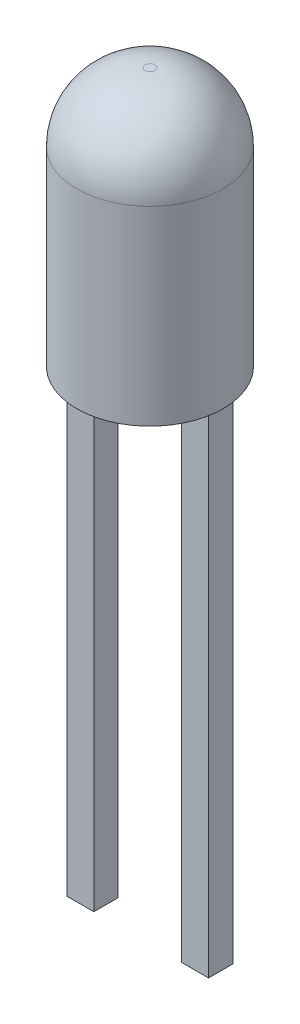
ISO-10303-21;
HEADER;
FILE_DESCRIPTION(('STEP AP214'),'2;1');
FILE_NAME('part.step','',(''),(''),'','','');
FILE_SCHEMA(('AUTOMOTIVE_DESIGN { 1 0 10303 214 1 1 1 1 }'));
ENDSEC;
DATA;
#1=APPLICATION_CONTEXT('core data for automotive mechanical design processes');
#2=APPLICATION_PROTOCOL_DEFINITION('international standard','automotive_design',2000,#1);
#3=PRODUCT_CONTEXT('',#1,'mechanical');
#4=PRODUCT('Part','Part','',(#3));
#5=PRODUCT_RELATED_PRODUCT_CATEGORY('part','',(#4));
#6=PRODUCT_DEFINITION_FORMATION('','',#4);
#7=PRODUCT_DEFINITION_CONTEXT('part definition',#1,'design');
#8=PRODUCT_DEFINITION('design','',#6,#7);
#9=PRODUCT_DEFINITION_SHAPE('','',#8);
#10=(LENGTH_UNIT() NAMED_UNIT(*) SI_UNIT(.MILLI.,.METRE.));
#11=(NAMED_UNIT(*) PLANE_ANGLE_UNIT() SI_UNIT($,.RADIAN.));
#12=(NAMED_UNIT(*) SI_UNIT($,.STERADIAN.) SOLID_ANGLE_UNIT());
#13=UNCERTAINTY_MEASURE_WITH_UNIT(LENGTH_MEASURE(1.E-05),#10,'distance_accuracy_value','');
#14=(GEOMETRIC_REPRESENTATION_CONTEXT(3) GLOBAL_UNCERTAINTY_ASSIGNED_CONTEXT((#13)) GLOBAL_UNIT_ASSIGNED_CONTEXT((#10,
#11,#12)) REPRESENTATION_CONTEXT('',''));
#15=CARTESIAN_POINT('',(0.,0.,0.));
#16=DIRECTION('',(0.,0.,1.));
#17=DIRECTION('',(1.,0.,0.));
#18=AXIS2_PLACEMENT_3D('',#15,#16,#17);
#19=CARTESIAN_POINT('',(0.899999999999999,-10.,0.25));
#20=DIRECTION('',(1.,0.,0.));
#21=DIRECTION('',(0.,0.,-1.));
#22=AXIS2_PLACEMENT_3D('',#19,#20,#21);
#23=PLANE('',#22);
#24=DIRECTION('',(0.,0.,-1.));
#25=VECTOR('',#24,1.);
#26=CARTESIAN_POINT('',(0.899999999999999,0.,0.25));
#27=LINE('',#26,#25);
#28=CARTESIAN_POINT('',(0.899999999999999,0.,0.25));
#29=VERTEX_POINT('',#28);
#30=CARTESIAN_POINT('',(0.899999999999999,0.,-0.25));
#31=VERTEX_POINT('',#30);
#32=EDGE_CURVE('E108',#29,#31,#27,.T.);
#33=ORIENTED_EDGE('',*,*,#32,.T.);
#34=DIRECTION('',(0.,1.,0.));
#35=VECTOR('',#34,1.);
#36=CARTESIAN_POINT('',(0.899999999999999,-10.,-0.25));
#37=LINE('',#36,#35);
#38=CARTESIAN_POINT('',(0.899999999999999,-10.,-0.25));
#39=VERTEX_POINT('',#38);
#40=EDGE_CURVE('E12',#39,#31,#37,.T.);
#41=ORIENTED_EDGE('',*,*,#40,.F.);
#42=DIRECTION('',(0.,0.,-1.));
#43=VECTOR('',#42,1.);
#44=CARTESIAN_POINT('',(0.899999999999999,-10.,0.25));
#45=LINE('',#44,#43);
#46=CARTESIAN_POINT('',(0.899999999999999,-10.,0.25));
#47=VERTEX_POINT('',#46);
#48=EDGE_CURVE('E96',#47,#39,#45,.T.);
#49=ORIENTED_EDGE('',*,*,#48,.F.);
#50=DIRECTION('',(0.,1.,0.));
#51=VECTOR('',#50,1.);
#52=CARTESIAN_POINT('',(0.899999999999999,-10.,0.25));
#53=LINE('',#52,#51);
#54=EDGE_CURVE('E104',#47,#29,#53,.T.);
#55=ORIENTED_EDGE('',*,*,#54,.T.);
#56=EDGE_LOOP('',(#33,#41,#49,#55));
#57=FACE_BOUND('',#56,.T.);
#58=ADVANCED_FACE('F45',(#57),#23,.F.);
#59=CARTESIAN_POINT('',(0.899999999999999,-10.,-0.25));
#60=DIRECTION('',(0.,0.,1.));
#61=DIRECTION('',(1.,0.,0.));
#62=AXIS2_PLACEMENT_3D('',#59,#60,#61);
#63=PLANE('',#62);
#64=DIRECTION('',(1.,0.,0.));
#65=VECTOR('',#64,1.);
#66=CARTESIAN_POINT('',(0.899999999999999,0.,-0.25));
#67=LINE('',#66,#65);
#68=CARTESIAN_POINT('',(1.45,0.,-0.25));
#69=VERTEX_POINT('',#68);
#70=EDGE_CURVE('E100',#31,#69,#67,.T.);
#71=ORIENTED_EDGE('',*,*,#70,.T.);
#72=DIRECTION('',(0.,1.,0.));
#73=VECTOR('',#72,1.);
#74=CARTESIAN_POINT('',(1.45,-10.,-0.25));
#75=LINE('',#74,#73);
#76=CARTESIAN_POINT('',(1.45,-10.,-0.25));
#77=VERTEX_POINT('',#76);
#78=EDGE_CURVE('E53',#77,#69,#75,.T.);
#79=ORIENTED_EDGE('',*,*,#78,.F.);
#80=DIRECTION('',(1.,0.,0.));
#81=VECTOR('',#80,1.);
#82=CARTESIAN_POINT('',(0.899999999999999,-10.,-0.25));
#83=LINE('',#82,#81);
#84=EDGE_CURVE('E91',#39,#77,#83,.T.);
#85=ORIENTED_EDGE('',*,*,#84,.F.);
#86=ORIENTED_EDGE('',*,*,#40,.T.);
#87=EDGE_LOOP('',(#71,#79,#85,#86));
#88=FACE_BOUND('',#87,.T.);
#89=ADVANCED_FACE('F99',(#88),#63,.F.);
#90=CARTESIAN_POINT('',(1.45,-10.,0.25));
#91=DIRECTION('',(-1.,0.,0.));
#92=DIRECTION('',(0.,0.,1.));
#93=AXIS2_PLACEMENT_3D('',#90,#91,#92);
#94=PLANE('',#93);
#95=DIRECTION('',(0.,0.,1.));
#96=VECTOR('',#95,1.);
#97=CARTESIAN_POINT('',(1.45,0.,0.25));
#98=LINE('',#97,#96);
#99=CARTESIAN_POINT('',(1.45,0.,0.25));
#100=VERTEX_POINT('',#99);
#101=EDGE_CURVE('E78',#69,#100,#98,.T.);
#102=ORIENTED_EDGE('',*,*,#101,.T.);
#103=DIRECTION('',(0.,1.,0.));
#104=VECTOR('',#103,1.);
#105=CARTESIAN_POINT('',(1.45,-10.,0.25));
#106=LINE('',#105,#104);
#107=CARTESIAN_POINT('',(1.45,-10.,0.25));
#108=VERTEX_POINT('',#107);
#109=EDGE_CURVE('E101',#108,#100,#106,.T.);
#110=ORIENTED_EDGE('',*,*,#109,.F.);
#111=DIRECTION('',(0.,0.,1.));
#112=VECTOR('',#111,1.);
#113=CARTESIAN_POINT('',(1.45,-10.,0.25));
#114=LINE('',#113,#112);
#115=EDGE_CURVE('E94',#77,#108,#114,.T.);
#116=ORIENTED_EDGE('',*,*,#115,.F.);
#117=ORIENTED_EDGE('',*,*,#78,.T.);
#118=EDGE_LOOP('',(#102,#110,#116,#117));
#119=FACE_BOUND('',#118,.T.);
#120=ADVANCED_FACE('F102',(#119),#94,.F.);
#121=CARTESIAN_POINT('',(0.899999999999999,-10.,0.25));
#122=DIRECTION('',(0.,0.,-1.));
#123=DIRECTION('',(-1.,0.,0.));
#124=AXIS2_PLACEMENT_3D('',#121,#122,#123);
#125=PLANE('',#124);
#126=DIRECTION('',(-1.,0.,0.));
#127=VECTOR('',#126,1.);
#128=CARTESIAN_POINT('',(0.899999999999999,0.,0.25));
#129=LINE('',#128,#127);
#130=EDGE_CURVE('E84',#100,#29,#129,.T.);
#131=ORIENTED_EDGE('',*,*,#130,.T.);
#132=ORIENTED_EDGE('',*,*,#54,.F.);
#133=DIRECTION('',(-1.,0.,0.));
#134=VECTOR('',#133,1.);
#135=CARTESIAN_POINT('',(0.899999999999999,-10.,0.25));
#136=LINE('',#135,#134);
#137=EDGE_CURVE('E61',#108,#47,#136,.T.);
#138=ORIENTED_EDGE('',*,*,#137,.F.);
#139=ORIENTED_EDGE('',*,*,#109,.T.);
#140=EDGE_LOOP('',(#131,#132,#138,#139));
#141=FACE_BOUND('',#140,.T.);
#142=ADVANCED_FACE('F115',(#141),#125,.F.);
#143=CARTESIAN_POINT('',(0.,-10.,0.));
#144=DIRECTION('',(0.,-1.,0.));
#145=DIRECTION('',(0.,0.,-1.));
#146=AXIS2_PLACEMENT_3D('',#143,#144,#145);
#147=PLANE('',#146);
#148=ORIENTED_EDGE('',*,*,#48,.T.);
#149=ORIENTED_EDGE('',*,*,#84,.T.);
#150=ORIENTED_EDGE('',*,*,#115,.T.);
#151=ORIENTED_EDGE('',*,*,#137,.T.);
#152=EDGE_LOOP('',(#148,#149,#150,#151));
#153=FACE_BOUND('',#152,.T.);
#154=ADVANCED_FACE('F92',(#153),#147,.T.);
#155=CARTESIAN_POINT('',(0.,0.,0.));
#156=DIRECTION('',(0.,-1.,0.));
#157=DIRECTION('',(0.,0.,-1.));
#158=AXIS2_PLACEMENT_3D('',#155,#156,#157);
#159=PLANE('',#158);
#160=ORIENTED_EDGE('',*,*,#32,.F.);
#161=ORIENTED_EDGE('',*,*,#130,.F.);
#162=ORIENTED_EDGE('',*,*,#101,.F.);
#163=ORIENTED_EDGE('',*,*,#70,.F.);
#164=EDGE_LOOP('',(#160,#161,#162,#163));
#165=FACE_BOUND('',#164,.T.);
#166=ADVANCED_FACE('F118',(#165),#159,.F.);
#167=CLOSED_SHELL('',(#58,#89,#120,#142,#154,#166));
#168=MANIFOLD_SOLID_BREP('B2',#167);
#169=CARTESIAN_POINT('',(-1.45,-10.,0.25));
#170=DIRECTION('',(1.,0.,0.));
#171=DIRECTION('',(0.,0.,-1.));
#172=AXIS2_PLACEMENT_3D('',#169,#170,#171);
#173=PLANE('',#172);
#174=DIRECTION('',(0.,0.,-1.));
#175=VECTOR('',#174,1.);
#176=CARTESIAN_POINT('',(-1.45,0.,0.25));
#177=LINE('',#176,#175);
#178=CARTESIAN_POINT('',(-1.45,0.,0.25));
#179=VERTEX_POINT('',#178);
#180=CARTESIAN_POINT('',(-1.45,0.,-0.25));
#181=VERTEX_POINT('',#180);
#182=EDGE_CURVE('E241',#179,#181,#177,.T.);
#183=ORIENTED_EDGE('',*,*,#182,.T.);
#184=DIRECTION('',(0.,1.,0.));
#185=VECTOR('',#184,1.);
#186=CARTESIAN_POINT('',(-1.45,-10.,-0.25));
#187=LINE('',#186,#185);
#188=CARTESIAN_POINT('',(-1.45,-10.,-0.25));
#189=VERTEX_POINT('',#188);
#190=EDGE_CURVE('E43',#189,#181,#187,.T.);
#191=ORIENTED_EDGE('',*,*,#190,.F.);
#192=DIRECTION('',(0.,0.,-1.));
#193=VECTOR('',#192,1.);
#194=CARTESIAN_POINT('',(-1.45,-10.,0.25));
#195=LINE('',#194,#193);
#196=CARTESIAN_POINT('',(-1.45,-10.,0.25));
#197=VERTEX_POINT('',#196);
#198=EDGE_CURVE('E229',#197,#189,#195,.T.);
#199=ORIENTED_EDGE('',*,*,#198,.F.);
#200=DIRECTION('',(0.,1.,0.));
#201=VECTOR('',#200,1.);
#202=CARTESIAN_POINT('',(-1.45,-10.,0.25));
#203=LINE('',#202,#201);
#204=EDGE_CURVE('E237',#197,#179,#203,.T.);
#205=ORIENTED_EDGE('',*,*,#204,.T.);
#206=EDGE_LOOP('',(#183,#191,#199,#205));
#207=FACE_BOUND('',#206,.T.);
#208=ADVANCED_FACE('F178',(#207),#173,.F.);
#209=CARTESIAN_POINT('',(-1.45,-10.,-0.25));
#210=DIRECTION('',(0.,0.,1.));
#211=DIRECTION('',(1.,0.,0.));
#212=AXIS2_PLACEMENT_3D('',#209,#210,#211);
#213=PLANE('',#212);
#214=DIRECTION('',(1.,0.,0.));
#215=VECTOR('',#214,1.);
#216=CARTESIAN_POINT('',(-1.45,0.,-0.25));
#217=LINE('',#216,#215);
#218=CARTESIAN_POINT('',(-0.9,0.,-0.25));
#219=VERTEX_POINT('',#218);
#220=EDGE_CURVE('E233',#181,#219,#217,.T.);
#221=ORIENTED_EDGE('',*,*,#220,.T.);
#222=DIRECTION('',(0.,1.,0.));
#223=VECTOR('',#222,1.);
#224=CARTESIAN_POINT('',(-0.9,-10.,-0.25));
#225=LINE('',#224,#223);
#226=CARTESIAN_POINT('',(-0.9,-10.,-0.25));
#227=VERTEX_POINT('',#226);
#228=EDGE_CURVE('E186',#227,#219,#225,.T.);
#229=ORIENTED_EDGE('',*,*,#228,.F.);
#230=DIRECTION('',(1.,0.,0.));
#231=VECTOR('',#230,1.);
#232=CARTESIAN_POINT('',(-1.45,-10.,-0.25));
#233=LINE('',#232,#231);
#234=EDGE_CURVE('E224',#189,#227,#233,.T.);
#235=ORIENTED_EDGE('',*,*,#234,.F.);
#236=ORIENTED_EDGE('',*,*,#190,.T.);
#237=EDGE_LOOP('',(#221,#229,#235,#236));
#238=FACE_BOUND('',#237,.T.);
#239=ADVANCED_FACE('F232',(#238),#213,.F.);
#240=CARTESIAN_POINT('',(-0.9,-10.,0.25));
#241=DIRECTION('',(-1.,0.,0.));
#242=DIRECTION('',(0.,0.,1.));
#243=AXIS2_PLACEMENT_3D('',#240,#241,#242);
#244=PLANE('',#243);
#245=DIRECTION('',(0.,0.,1.));
#246=VECTOR('',#245,1.);
#247=CARTESIAN_POINT('',(-0.9,0.,0.25));
#248=LINE('',#247,#246);
#249=CARTESIAN_POINT('',(-0.9,0.,0.25));
#250=VERTEX_POINT('',#249);
#251=EDGE_CURVE('E211',#219,#250,#248,.T.);
#252=ORIENTED_EDGE('',*,*,#251,.T.);
#253=DIRECTION('',(0.,1.,0.));
#254=VECTOR('',#253,1.);
#255=CARTESIAN_POINT('',(-0.9,-10.,0.25));
#256=LINE('',#255,#254);
#257=CARTESIAN_POINT('',(-0.9,-10.,0.25));
#258=VERTEX_POINT('',#257);
#259=EDGE_CURVE('E234',#258,#250,#256,.T.);
#260=ORIENTED_EDGE('',*,*,#259,.F.);
#261=DIRECTION('',(0.,0.,1.));
#262=VECTOR('',#261,1.);
#263=CARTESIAN_POINT('',(-0.9,-10.,0.25));
#264=LINE('',#263,#262);
#265=EDGE_CURVE('E227',#227,#258,#264,.T.);
#266=ORIENTED_EDGE('',*,*,#265,.F.);
#267=ORIENTED_EDGE('',*,*,#228,.T.);
#268=EDGE_LOOP('',(#252,#260,#266,#267));
#269=FACE_BOUND('',#268,.T.);
#270=ADVANCED_FACE('F235',(#269),#244,.F.);
#271=CARTESIAN_POINT('',(-1.45,-10.,0.25));
#272=DIRECTION('',(0.,0.,-1.));
#273=DIRECTION('',(-1.,0.,0.));
#274=AXIS2_PLACEMENT_3D('',#271,#272,#273);
#275=PLANE('',#274);
#276=DIRECTION('',(-1.,0.,0.));
#277=VECTOR('',#276,1.);
#278=CARTESIAN_POINT('',(-1.45,0.,0.25));
#279=LINE('',#278,#277);
#280=EDGE_CURVE('E217',#250,#179,#279,.T.);
#281=ORIENTED_EDGE('',*,*,#280,.T.);
#282=ORIENTED_EDGE('',*,*,#204,.F.);
#283=DIRECTION('',(-1.,0.,0.));
#284=VECTOR('',#283,1.);
#285=CARTESIAN_POINT('',(-1.45,-10.,0.25));
#286=LINE('',#285,#284);
#287=EDGE_CURVE('E194',#258,#197,#286,.T.);
#288=ORIENTED_EDGE('',*,*,#287,.F.);
#289=ORIENTED_EDGE('',*,*,#259,.T.);
#290=EDGE_LOOP('',(#281,#282,#288,#289));
#291=FACE_BOUND('',#290,.T.);
#292=ADVANCED_FACE('F248',(#291),#275,.F.);
#293=CARTESIAN_POINT('',(0.,-10.,0.));
#294=DIRECTION('',(0.,-1.,0.));
#295=DIRECTION('',(0.,0.,-1.));
#296=AXIS2_PLACEMENT_3D('',#293,#294,#295);
#297=PLANE('',#296);
#298=ORIENTED_EDGE('',*,*,#198,.T.);
#299=ORIENTED_EDGE('',*,*,#234,.T.);
#300=ORIENTED_EDGE('',*,*,#265,.T.);
#301=ORIENTED_EDGE('',*,*,#287,.T.);
#302=EDGE_LOOP('',(#298,#299,#300,#301));
#303=FACE_BOUND('',#302,.T.);
#304=ADVANCED_FACE('F225',(#303),#297,.T.);
#305=CARTESIAN_POINT('',(0.,0.,0.));
#306=DIRECTION('',(0.,-1.,0.));
#307=DIRECTION('',(0.,0.,-1.));
#308=AXIS2_PLACEMENT_3D('',#305,#306,#307);
#309=PLANE('',#308);
#310=ORIENTED_EDGE('',*,*,#182,.F.);
#311=ORIENTED_EDGE('',*,*,#280,.F.);
#312=ORIENTED_EDGE('',*,*,#251,.F.);
#313=ORIENTED_EDGE('',*,*,#220,.F.);
#314=EDGE_LOOP('',(#310,#311,#312,#313));
#315=FACE_BOUND('',#314,.T.);
#316=ADVANCED_FACE('F251',(#315),#309,.F.);
#317=CLOSED_SHELL('',(#208,#239,#270,#292,#304,#316));
#318=MANIFOLD_SOLID_BREP('B6',#317);
#319=CARTESIAN_POINT('',(1.45,0.,-0.25));
#320=DIRECTION('',(1.,0.,0.));
#321=DIRECTION('',(0.,1.,0.));
#322=AXIS2_PLACEMENT_3D('',#319,#320,#321);
#323=PLANE('',#322);
#324=DIRECTION('',(0.,0.,1.));
#325=VECTOR('',#324,1.);
#326=CARTESIAN_POINT('',(1.45,2.6,-0.25));
#327=LINE('',#326,#325);
#328=CARTESIAN_POINT('',(1.45,2.6,-0.25));
#329=VERTEX_POINT('',#328);
#330=CARTESIAN_POINT('',(1.45,2.6,0.25));
#331=VERTEX_POINT('',#330);
#332=EDGE_CURVE('E314',#329,#331,#327,.T.);
#333=ORIENTED_EDGE('',*,*,#332,.T.);
#334=DIRECTION('',(0.,1.,0.));
#335=VECTOR('',#334,1.);
#336=CARTESIAN_POINT('',(1.45,0.,0.25));
#337=LINE('',#336,#335);
#338=CARTESIAN_POINT('',(1.45,0.,0.25));
#339=VERTEX_POINT('',#338);
#340=EDGE_CURVE('E363',#339,#331,#337,.T.);
#341=ORIENTED_EDGE('',*,*,#340,.F.);
#342=DIRECTION('',(0.,0.,1.));
#343=VECTOR('',#342,1.);
#344=CARTESIAN_POINT('',(1.45,0.,-0.25));
#345=LINE('',#344,#343);
#346=CARTESIAN_POINT('',(1.45,0.,-0.25));
#347=VERTEX_POINT('',#346);
#348=EDGE_CURVE('E176',#347,#339,#345,.T.);
#349=ORIENTED_EDGE('',*,*,#348,.F.);
#350=DIRECTION('',(0.,1.,0.));
#351=VECTOR('',#350,1.);
#352=CARTESIAN_POINT('',(1.45,0.,-0.25));
#353=LINE('',#352,#351);
#354=EDGE_CURVE('E364',#347,#329,#353,.T.);
#355=ORIENTED_EDGE('',*,*,#354,.T.);
#356=EDGE_LOOP('',(#333,#341,#349,#355));
#357=FACE_BOUND('',#356,.T.);
#358=ADVANCED_FACE('F311',(#357),#323,.T.);
#359=CARTESIAN_POINT('',(0.899999999999999,0.,-0.25));
#360=DIRECTION('',(0.,-1.,0.));
#361=DIRECTION('',(1.,0.,0.));
#362=AXIS2_PLACEMENT_3D('',#359,#360,#361);
#363=PLANE('',#362);
#364=ORIENTED_EDGE('',*,*,#348,.T.);
#365=DIRECTION('',(1.,0.,0.));
#366=VECTOR('',#365,1.);
#367=CARTESIAN_POINT('',(0.899999999999999,0.,0.25));
#368=LINE('',#367,#366);
#369=CARTESIAN_POINT('',(0.899999999999999,0.,0.25));
#370=VERTEX_POINT('',#369);
#371=EDGE_CURVE('E381',#370,#339,#368,.T.);
#372=ORIENTED_EDGE('',*,*,#371,.F.);
#373=DIRECTION('',(0.,0.,1.));
#374=VECTOR('',#373,1.);
#375=CARTESIAN_POINT('',(0.899999999999999,0.,-0.25));
#376=LINE('',#375,#374);
#377=CARTESIAN_POINT('',(0.899999999999999,0.,-0.25));
#378=VERTEX_POINT('',#377);
#379=EDGE_CURVE('E319',#378,#370,#376,.T.);
#380=ORIENTED_EDGE('',*,*,#379,.F.);
#381=DIRECTION('',(1.,0.,0.));
#382=VECTOR('',#381,1.);
#383=CARTESIAN_POINT('',(0.899999999999999,0.,-0.25));
#384=LINE('',#383,#382);
#385=EDGE_CURVE('E369',#378,#347,#384,.T.);
#386=ORIENTED_EDGE('',*,*,#385,.T.);
#387=EDGE_LOOP('',(#364,#372,#380,#386));
#388=FACE_BOUND('',#387,.T.);
#389=ADVANCED_FACE('F421',(#388),#363,.T.);
#390=CARTESIAN_POINT('',(0.899999999999999,0.6,-0.25));
#391=DIRECTION('',(-1.,0.,0.));
#392=DIRECTION('',(0.,0.,1.));
#393=AXIS2_PLACEMENT_3D('',#390,#391,#392);
#394=PLANE('',#393);
#395=ORIENTED_EDGE('',*,*,#379,.T.);
#396=DIRECTION('',(0.,-1.,0.));
#397=VECTOR('',#396,1.);
#398=CARTESIAN_POINT('',(0.899999999999999,0.6,0.25));
#399=LINE('',#398,#397);
#400=CARTESIAN_POINT('',(0.899999999999999,0.6,0.25));
#401=VERTEX_POINT('',#400);
#402=EDGE_CURVE('E388',#401,#370,#399,.T.);
#403=ORIENTED_EDGE('',*,*,#402,.F.);
#404=DIRECTION('',(0.,0.,1.));
#405=VECTOR('',#404,1.);
#406=CARTESIAN_POINT('',(0.899999999999999,0.6,-0.25));
#407=LINE('',#406,#405);
#408=CARTESIAN_POINT('',(0.899999999999999,0.6,-0.25));
#409=VERTEX_POINT('',#408);
#410=EDGE_CURVE('E404',#409,#401,#407,.T.);
#411=ORIENTED_EDGE('',*,*,#410,.F.);
#412=DIRECTION('',(0.,-1.,0.));
#413=VECTOR('',#412,1.);
#414=CARTESIAN_POINT('',(0.899999999999999,0.6,-0.25));
#415=LINE('',#414,#413);
#416=EDGE_CURVE('E400',#409,#378,#415,.T.);
#417=ORIENTED_EDGE('',*,*,#416,.T.);
#418=EDGE_LOOP('',(#395,#403,#411,#417));
#419=FACE_BOUND('',#418,.T.);
#420=ADVANCED_FACE('F417',(#419),#394,.T.);
#421=CARTESIAN_POINT('',(0.496677265615149,0.6,-0.25));
#422=DIRECTION('',(0.,-1.,0.));
#423=DIRECTION('',(0.,0.,-1.));
#424=AXIS2_PLACEMENT_3D('',#421,#422,#423);
#425=PLANE('',#424);
#426=ORIENTED_EDGE('',*,*,#410,.T.);
#427=DIRECTION('',(1.,0.,0.));
#428=VECTOR('',#427,1.);
#429=CARTESIAN_POINT('',(0.496677265615149,0.6,0.25));
#430=LINE('',#429,#428);
#431=CARTESIAN_POINT('',(0.496677265615149,0.6,0.25));
#432=VERTEX_POINT('',#431);
#433=EDGE_CURVE('E385',#432,#401,#430,.T.);
#434=ORIENTED_EDGE('',*,*,#433,.F.);
#435=DIRECTION('',(0.,0.,1.));
#436=VECTOR('',#435,1.);
#437=CARTESIAN_POINT('',(0.496677265615149,0.6,-0.25));
#438=LINE('',#437,#436);
#439=CARTESIAN_POINT('',(0.496677265615149,0.6,-0.25));
#440=VERTEX_POINT('',#439);
#441=EDGE_CURVE('E406',#440,#432,#438,.T.);
#442=ORIENTED_EDGE('',*,*,#441,.F.);
#443=DIRECTION('',(1.,0.,0.));
#444=VECTOR('',#443,1.);
#445=CARTESIAN_POINT('',(0.496677265615149,0.6,-0.25));
#446=LINE('',#445,#444);
#447=EDGE_CURVE('E397',#440,#409,#446,.T.);
#448=ORIENTED_EDGE('',*,*,#447,.T.);
#449=EDGE_LOOP('',(#426,#434,#442,#448));
#450=FACE_BOUND('',#449,.T.);
#451=ADVANCED_FACE('F414',(#450),#425,.T.);
#452=CARTESIAN_POINT('',(-0.872452828416084,2.6,-0.25));
#453=DIRECTION('',(-0.825170902439274,-0.56488315762426,0.));
#454=DIRECTION('',(0.56488315762426,-0.825170902439274,0.));
#455=AXIS2_PLACEMENT_3D('',#452,#453,#454);
#456=PLANE('',#455);
#457=ORIENTED_EDGE('',*,*,#441,.T.);
#458=DIRECTION('',(0.56488315762426,-0.825170902439274,0.));
#459=VECTOR('',#458,1.);
#460=CARTESIAN_POINT('',(-0.872452828416084,2.6,0.25));
#461=LINE('',#460,#459);
#462=CARTESIAN_POINT('',(-0.872452828416084,2.6,0.25));
#463=VERTEX_POINT('',#462);
#464=EDGE_CURVE('E376',#463,#432,#461,.T.);
#465=ORIENTED_EDGE('',*,*,#464,.F.);
#466=DIRECTION('',(0.,0.,1.));
#467=VECTOR('',#466,1.);
#468=CARTESIAN_POINT('',(-0.872452828416084,2.6,-0.25));
#469=LINE('',#468,#467);
#470=CARTESIAN_POINT('',(-0.872452828416084,2.6,-0.25));
#471=VERTEX_POINT('',#470);
#472=EDGE_CURVE('E368',#471,#463,#469,.T.);
#473=ORIENTED_EDGE('',*,*,#472,.F.);
#474=DIRECTION('',(0.56488315762426,-0.825170902439274,0.));
#475=VECTOR('',#474,1.);
#476=CARTESIAN_POINT('',(-0.872452828416084,2.6,-0.25));
#477=LINE('',#476,#475);
#478=EDGE_CURVE('E394',#471,#440,#477,.T.);
#479=ORIENTED_EDGE('',*,*,#478,.T.);
#480=EDGE_LOOP('',(#457,#465,#473,#479));
#481=FACE_BOUND('',#480,.T.);
#482=ADVANCED_FACE('F408',(#481),#456,.T.);
#483=CARTESIAN_POINT('',(1.45,2.6,-0.25));
#484=DIRECTION('',(0.,1.,0.));
#485=DIRECTION('',(-1.,0.,0.));
#486=AXIS2_PLACEMENT_3D('',#483,#484,#485);
#487=PLANE('',#486);
#488=ORIENTED_EDGE('',*,*,#472,.T.);
#489=DIRECTION('',(-1.,0.,0.));
#490=VECTOR('',#489,1.);
#491=CARTESIAN_POINT('',(1.45,2.6,0.25));
#492=LINE('',#491,#490);
#493=EDGE_CURVE('E371',#331,#463,#492,.T.);
#494=ORIENTED_EDGE('',*,*,#493,.F.);
#495=ORIENTED_EDGE('',*,*,#332,.F.);
#496=DIRECTION('',(-1.,0.,0.));
#497=VECTOR('',#496,1.);
#498=CARTESIAN_POINT('',(1.45,2.6,-0.25));
#499=LINE('',#498,#497);
#500=EDGE_CURVE('E392',#329,#471,#499,.T.);
#501=ORIENTED_EDGE('',*,*,#500,.T.);
#502=EDGE_LOOP('',(#488,#494,#495,#501));
#503=FACE_BOUND('',#502,.T.);
#504=ADVANCED_FACE('F372',(#503),#487,.T.);
#505=CARTESIAN_POINT('',(0.,0.,-0.25));
#506=DIRECTION('',(0.,0.,1.));
#507=DIRECTION('',(1.,0.,0.));
#508=AXIS2_PLACEMENT_3D('',#505,#506,#507);
#509=PLANE('',#508);
#510=ORIENTED_EDGE('',*,*,#354,.F.);
#511=ORIENTED_EDGE('',*,*,#385,.F.);
#512=ORIENTED_EDGE('',*,*,#416,.F.);
#513=ORIENTED_EDGE('',*,*,#447,.F.);
#514=ORIENTED_EDGE('',*,*,#478,.F.);
#515=ORIENTED_EDGE('',*,*,#500,.F.);
#516=EDGE_LOOP('',(#510,#511,#512,#513,#514,#515));
#517=FACE_BOUND('',#516,.T.);
#518=ADVANCED_FACE('F420',(#517),#509,.F.);
#519=CARTESIAN_POINT('',(0.,0.,0.25));
#520=DIRECTION('',(0.,0.,1.));
#521=DIRECTION('',(1.,0.,0.));
#522=AXIS2_PLACEMENT_3D('',#519,#520,#521);
#523=PLANE('',#522);
#524=ORIENTED_EDGE('',*,*,#340,.T.);
#525=ORIENTED_EDGE('',*,*,#493,.T.);
#526=ORIENTED_EDGE('',*,*,#464,.T.);
#527=ORIENTED_EDGE('',*,*,#433,.T.);
#528=ORIENTED_EDGE('',*,*,#402,.T.);
#529=ORIENTED_EDGE('',*,*,#371,.T.);
#530=EDGE_LOOP('',(#524,#525,#526,#527,#528,#529));
#531=FACE_BOUND('',#530,.T.);
#532=ADVANCED_FACE('F379',(#531),#523,.T.);
#533=CLOSED_SHELL('',(#358,#389,#420,#451,#482,#504,#518,#532));
#534=MANIFOLD_SOLID_BREP('B37',#533);
#535=CARTESIAN_POINT('',(-0.9,0.,-0.25));
#536=DIRECTION('',(1.,0.,0.));
#537=DIRECTION('',(0.,0.,-1.));
#538=AXIS2_PLACEMENT_3D('',#535,#536,#537);
#539=PLANE('',#538);
#540=DIRECTION('',(0.,0.,1.));
#541=VECTOR('',#540,1.);
#542=CARTESIAN_POINT('',(-0.9,0.6,-0.25));
#543=LINE('',#542,#541);
#544=CARTESIAN_POINT('',(-0.9,0.6,-0.25));
#545=VERTEX_POINT('',#544);
#546=CARTESIAN_POINT('',(-0.9,0.6,0.25));
#547=VERTEX_POINT('',#546);
#548=EDGE_CURVE('E496',#545,#547,#543,.T.);
#549=ORIENTED_EDGE('',*,*,#548,.T.);
#550=DIRECTION('',(0.,1.,0.));
#551=VECTOR('',#550,1.);
#552=CARTESIAN_POINT('',(-0.9,0.,0.25));
#553=LINE('',#552,#551);
#554=CARTESIAN_POINT('',(-0.9,0.,0.25));
#555=VERTEX_POINT('',#554);
#556=EDGE_CURVE('E551',#555,#547,#553,.T.);
#557=ORIENTED_EDGE('',*,*,#556,.F.);
#558=DIRECTION('',(0.,0.,1.));
#559=VECTOR('',#558,1.);
#560=CARTESIAN_POINT('',(-0.9,0.,-0.25));
#561=LINE('',#560,#559);
#562=CARTESIAN_POINT('',(-0.9,0.,-0.25));
#563=VERTEX_POINT('',#562);
#564=EDGE_CURVE('E309',#563,#555,#561,.T.);
#565=ORIENTED_EDGE('',*,*,#564,.F.);
#566=DIRECTION('',(0.,1.,0.));
#567=VECTOR('',#566,1.);
#568=CARTESIAN_POINT('',(-0.9,0.,-0.25));
#569=LINE('',#568,#567);
#570=EDGE_CURVE('E552',#563,#545,#569,.T.);
#571=ORIENTED_EDGE('',*,*,#570,.T.);
#572=EDGE_LOOP('',(#549,#557,#565,#571));
#573=FACE_BOUND('',#572,.T.);
#574=ADVANCED_FACE('F493',(#573),#539,.T.);
#575=CARTESIAN_POINT('',(-1.45,0.,-0.25));
#576=DIRECTION('',(0.,-1.,0.));
#577=DIRECTION('',(1.,0.,0.));
#578=AXIS2_PLACEMENT_3D('',#575,#576,#577);
#579=PLANE('',#578);
#580=ORIENTED_EDGE('',*,*,#564,.T.);
#581=DIRECTION('',(1.,0.,0.));
#582=VECTOR('',#581,1.);
#583=CARTESIAN_POINT('',(-1.45,0.,0.25));
#584=LINE('',#583,#582);
#585=CARTESIAN_POINT('',(-1.45,0.,0.25));
#586=VERTEX_POINT('',#585);
#587=EDGE_CURVE('E569',#586,#555,#584,.T.);
#588=ORIENTED_EDGE('',*,*,#587,.F.);
#589=DIRECTION('',(0.,0.,1.));
#590=VECTOR('',#589,1.);
#591=CARTESIAN_POINT('',(-1.45,0.,-0.25));
#592=LINE('',#591,#590);
#593=CARTESIAN_POINT('',(-1.45,0.,-0.25));
#594=VERTEX_POINT('',#593);
#595=EDGE_CURVE('E501',#594,#586,#592,.T.);
#596=ORIENTED_EDGE('',*,*,#595,.F.);
#597=DIRECTION('',(1.,0.,0.));
#598=VECTOR('',#597,1.);
#599=CARTESIAN_POINT('',(-1.45,0.,-0.25));
#600=LINE('',#599,#598);
#601=EDGE_CURVE('E557',#594,#563,#600,.T.);
#602=ORIENTED_EDGE('',*,*,#601,.T.);
#603=EDGE_LOOP('',(#580,#588,#596,#602));
#604=FACE_BOUND('',#603,.T.);
#605=ADVANCED_FACE('F621',(#604),#579,.T.);
#606=CARTESIAN_POINT('',(-1.45,2.6,-0.25));
#607=DIRECTION('',(-1.,0.,0.));
#608=DIRECTION('',(0.,0.,1.));
#609=AXIS2_PLACEMENT_3D('',#606,#607,#608);
#610=PLANE('',#609);
#611=ORIENTED_EDGE('',*,*,#595,.T.);
#612=DIRECTION('',(0.,-1.,0.));
#613=VECTOR('',#612,1.);
#614=CARTESIAN_POINT('',(-1.45,2.6,0.25));
#615=LINE('',#614,#613);
#616=CARTESIAN_POINT('',(-1.45,2.6,0.25));
#617=VERTEX_POINT('',#616);
#618=EDGE_CURVE('E579',#617,#586,#615,.T.);
#619=ORIENTED_EDGE('',*,*,#618,.F.);
#620=DIRECTION('',(0.,0.,1.));
#621=VECTOR('',#620,1.);
#622=CARTESIAN_POINT('',(-1.45,2.6,-0.25));
#623=LINE('',#622,#621);
#624=CARTESIAN_POINT('',(-1.45,2.6,-0.25));
#625=VERTEX_POINT('',#624);
#626=EDGE_CURVE('E598',#625,#617,#623,.T.);
#627=ORIENTED_EDGE('',*,*,#626,.F.);
#628=DIRECTION('',(0.,-1.,0.));
#629=VECTOR('',#628,1.);
#630=CARTESIAN_POINT('',(-1.45,2.6,-0.25));
#631=LINE('',#630,#629);
#632=EDGE_CURVE('E594',#625,#594,#631,.T.);
#633=ORIENTED_EDGE('',*,*,#632,.T.);
#634=EDGE_LOOP('',(#611,#619,#627,#633));
#635=FACE_BOUND('',#634,.T.);
#636=ADVANCED_FACE('F619',(#635),#610,.T.);
#637=CARTESIAN_POINT('',(-1.22535509609001,2.6,-0.25));
#638=DIRECTION('',(0.,1.,0.));
#639=DIRECTION('',(0.,0.,1.));
#640=AXIS2_PLACEMENT_3D('',#637,#638,#639);
#641=PLANE('',#640);
#642=ORIENTED_EDGE('',*,*,#626,.T.);
#643=DIRECTION('',(-1.,0.,0.));
#644=VECTOR('',#643,1.);
#645=CARTESIAN_POINT('',(-1.22535509609001,2.6,0.25));
#646=LINE('',#645,#644);
#647=CARTESIAN_POINT('',(-1.22535509609001,2.6,0.25));
#648=VERTEX_POINT('',#647);
#649=EDGE_CURVE('E576',#648,#617,#646,.T.);
#650=ORIENTED_EDGE('',*,*,#649,.F.);
#651=DIRECTION('',(0.,0.,1.));
#652=VECTOR('',#651,1.);
#653=CARTESIAN_POINT('',(-1.22535509609001,2.6,-0.25));
#654=LINE('',#653,#652);
#655=CARTESIAN_POINT('',(-1.22535509609001,2.6,-0.25));
#656=VERTEX_POINT('',#655);
#657=EDGE_CURVE('E600',#656,#648,#654,.T.);
#658=ORIENTED_EDGE('',*,*,#657,.F.);
#659=DIRECTION('',(-1.,0.,0.));
#660=VECTOR('',#659,1.);
#661=CARTESIAN_POINT('',(-1.22535509609001,2.6,-0.25));
#662=LINE('',#661,#660);
#663=EDGE_CURVE('E591',#656,#625,#662,.T.);
#664=ORIENTED_EDGE('',*,*,#663,.T.);
#665=EDGE_LOOP('',(#642,#650,#658,#664));
#666=FACE_BOUND('',#665,.T.);
#667=ADVANCED_FACE('F613',(#666),#641,.T.);
#668=CARTESIAN_POINT('',(-0.62411419560851,0.825037810223286,-0.25));
#669=DIRECTION('',(0.947137436510032,0.320828110303952,0.));
#670=DIRECTION('',(-0.320828110303952,0.947137436510032,0.));
#671=AXIS2_PLACEMENT_3D('',#668,#669,#670);
#672=PLANE('',#671);
#673=ORIENTED_EDGE('',*,*,#657,.T.);
#674=DIRECTION('',(-0.320828110303952,0.947137436510032,0.));
#675=VECTOR('',#674,1.);
#676=CARTESIAN_POINT('',(-0.62411419560851,0.825037810223286,0.25));
#677=LINE('',#676,#675);
#678=CARTESIAN_POINT('',(-0.62411419560851,0.825037810223286,0.25));
#679=VERTEX_POINT('',#678);
#680=EDGE_CURVE('E573',#679,#648,#677,.T.);
#681=ORIENTED_EDGE('',*,*,#680,.F.);
#682=DIRECTION('',(0.,0.,1.));
#683=VECTOR('',#682,1.);
#684=CARTESIAN_POINT('',(-0.62411419560851,0.825037810223286,-0.25));
#685=LINE('',#684,#683);
#686=CARTESIAN_POINT('',(-0.62411419560851,0.825037810223286,-0.25));
#687=VERTEX_POINT('',#686);
#688=EDGE_CURVE('E602',#687,#679,#685,.T.);
#689=ORIENTED_EDGE('',*,*,#688,.F.);
#690=DIRECTION('',(-0.320828110303952,0.947137436510032,0.));
#691=VECTOR('',#690,1.);
#692=CARTESIAN_POINT('',(-0.62411419560851,0.825037810223286,-0.25));
#693=LINE('',#692,#691);
#694=EDGE_CURVE('E588',#687,#656,#693,.T.);
#695=ORIENTED_EDGE('',*,*,#694,.T.);
#696=EDGE_LOOP('',(#673,#681,#689,#695));
#697=FACE_BOUND('',#696,.T.);
#698=ADVANCED_FACE('F610',(#697),#672,.T.);
#699=CARTESIAN_POINT('',(-0.62411419560851,0.6,-0.25));
#700=DIRECTION('',(1.,0.,0.));
#701=DIRECTION('',(0.,0.,-1.));
#702=AXIS2_PLACEMENT_3D('',#699,#700,#701);
#703=PLANE('',#702);
#704=ORIENTED_EDGE('',*,*,#688,.T.);
#705=DIRECTION('',(0.,1.,0.));
#706=VECTOR('',#705,1.);
#707=CARTESIAN_POINT('',(-0.62411419560851,0.6,0.25));
#708=LINE('',#707,#706);
#709=CARTESIAN_POINT('',(-0.62411419560851,0.6,0.25));
#710=VERTEX_POINT('',#709);
#711=EDGE_CURVE('E564',#710,#679,#708,.T.);
#712=ORIENTED_EDGE('',*,*,#711,.F.);
#713=DIRECTION('',(0.,0.,1.));
#714=VECTOR('',#713,1.);
#715=CARTESIAN_POINT('',(-0.62411419560851,0.6,-0.25));
#716=LINE('',#715,#714);
#717=CARTESIAN_POINT('',(-0.62411419560851,0.6,-0.25));
#718=VERTEX_POINT('',#717);
#719=EDGE_CURVE('E556',#718,#710,#716,.T.);
#720=ORIENTED_EDGE('',*,*,#719,.F.);
#721=DIRECTION('',(0.,1.,0.));
#722=VECTOR('',#721,1.);
#723=CARTESIAN_POINT('',(-0.62411419560851,0.6,-0.25));
#724=LINE('',#723,#722);
#725=EDGE_CURVE('E585',#718,#687,#724,.T.);
#726=ORIENTED_EDGE('',*,*,#725,.T.);
#727=EDGE_LOOP('',(#704,#712,#720,#726));
#728=FACE_BOUND('',#727,.T.);
#729=ADVANCED_FACE('F604',(#728),#703,.T.);
#730=CARTESIAN_POINT('',(-0.9,0.6,-0.25));
#731=DIRECTION('',(0.,-1.,0.));
#732=DIRECTION('',(0.,0.,-1.));
#733=AXIS2_PLACEMENT_3D('',#730,#731,#732);
#734=PLANE('',#733);
#735=ORIENTED_EDGE('',*,*,#719,.T.);
#736=DIRECTION('',(1.,0.,0.));
#737=VECTOR('',#736,1.);
#738=CARTESIAN_POINT('',(-0.9,0.6,0.25));
#739=LINE('',#738,#737);
#740=EDGE_CURVE('E559',#547,#710,#739,.T.);
#741=ORIENTED_EDGE('',*,*,#740,.F.);
#742=ORIENTED_EDGE('',*,*,#548,.F.);
#743=DIRECTION('',(1.,0.,0.));
#744=VECTOR('',#743,1.);
#745=CARTESIAN_POINT('',(-0.9,0.6,-0.25));
#746=LINE('',#745,#744);
#747=EDGE_CURVE('E583',#545,#718,#746,.T.);
#748=ORIENTED_EDGE('',*,*,#747,.T.);
#749=EDGE_LOOP('',(#735,#741,#742,#748));
#750=FACE_BOUND('',#749,.T.);
#751=ADVANCED_FACE('F560',(#750),#734,.T.);
#752=CARTESIAN_POINT('',(0.,0.,-0.25));
#753=DIRECTION('',(0.,0.,-1.));
#754=DIRECTION('',(-1.,0.,0.));
#755=AXIS2_PLACEMENT_3D('',#752,#753,#754);
#756=PLANE('',#755);
#757=ORIENTED_EDGE('',*,*,#570,.F.);
#758=ORIENTED_EDGE('',*,*,#601,.F.);
#759=ORIENTED_EDGE('',*,*,#632,.F.);
#760=ORIENTED_EDGE('',*,*,#663,.F.);
#761=ORIENTED_EDGE('',*,*,#694,.F.);
#762=ORIENTED_EDGE('',*,*,#725,.F.);
#763=ORIENTED_EDGE('',*,*,#747,.F.);
#764=EDGE_LOOP('',(#757,#758,#759,#760,#761,#762,#763));
#765=FACE_BOUND('',#764,.T.);
#766=ADVANCED_FACE('F616',(#765),#756,.T.);
#767=CARTESIAN_POINT('',(0.,0.,0.25));
#768=DIRECTION('',(0.,0.,-1.));
#769=DIRECTION('',(-1.,0.,0.));
#770=AXIS2_PLACEMENT_3D('',#767,#768,#769);
#771=PLANE('',#770);
#772=ORIENTED_EDGE('',*,*,#556,.T.);
#773=ORIENTED_EDGE('',*,*,#740,.T.);
#774=ORIENTED_EDGE('',*,*,#711,.T.);
#775=ORIENTED_EDGE('',*,*,#680,.T.);
#776=ORIENTED_EDGE('',*,*,#649,.T.);
#777=ORIENTED_EDGE('',*,*,#618,.T.);
#778=ORIENTED_EDGE('',*,*,#587,.T.);
#779=EDGE_LOOP('',(#772,#773,#774,#775,#776,#777,#778));
#780=FACE_BOUND('',#779,.T.);
#781=ADVANCED_FACE('F567',(#780),#771,.F.);
#782=CLOSED_SHELL('',(#574,#605,#636,#667,#698,#729,#751,#766,#781));
#783=MANIFOLD_SOLID_BREP('B170',#782);
#784=CARTESIAN_POINT('',(0.,5.3,0.));
#785=DIRECTION('',(0.,-1.,0.));
#786=DIRECTION('',(0.,0.,-1.));
#787=AXIS2_PLACEMENT_3D('',#784,#785,#786);
#788=CYLINDRICAL_SURFACE('',#787,1.5);
#789=CARTESIAN_POINT('',(0.,3.9,0.));
#790=DIRECTION('',(0.,1.,0.));
#791=DIRECTION('',(0.,0.,1.));
#792=AXIS2_PLACEMENT_3D('',#789,#790,#791);
#793=CIRCLE('',#792,1.5);
#794=CARTESIAN_POINT('',(0.,3.9,1.5));
#795=VERTEX_POINT('',#794);
#796=EDGE_CURVE('E492',#795,#795,#793,.F.);
#797=ORIENTED_EDGE('',*,*,#796,.T.);
#798=EDGE_LOOP('',(#797));
#799=FACE_BOUND('',#798,.T.);
#800=CARTESIAN_POINT('',(0.,0.,0.));
#801=DIRECTION('',(0.,1.,0.));
#802=DIRECTION('',(0.,0.,1.));
#803=AXIS2_PLACEMENT_3D('',#800,#801,#802);
#804=CIRCLE('',#803,1.5);
#805=CARTESIAN_POINT('',(0.,0.,1.5));
#806=VERTEX_POINT('',#805);
#807=EDGE_CURVE('E705',#806,#806,#804,.T.);
#808=ORIENTED_EDGE('',*,*,#807,.T.);
#809=EDGE_LOOP('',(#808));
#810=FACE_BOUND('',#809,.T.);
#811=ADVANCED_FACE('F694',(#799,#810),#788,.T.);
#812=CARTESIAN_POINT('',(0.,5.3,0.));
#813=DIRECTION('',(0.,1.,0.));
#814=DIRECTION('',(0.,0.,1.));
#815=AXIS2_PLACEMENT_3D('',#812,#813,#814);
#816=PLANE('',#815);
#817=CARTESIAN_POINT('',(0.,5.3,0.));
#818=DIRECTION('',(0.,1.,0.));
#819=DIRECTION('',(0.,0.,1.));
#820=AXIS2_PLACEMENT_3D('',#817,#818,#819);
#821=CIRCLE('',#820,0.1);
#822=CARTESIAN_POINT('',(0.,5.3,0.1));
#823=VERTEX_POINT('',#822);
#824=EDGE_CURVE('E701',#823,#823,#821,.T.);
#825=ORIENTED_EDGE('',*,*,#824,.T.);
#826=EDGE_LOOP('',(#825));
#827=FACE_BOUND('',#826,.T.);
#828=ADVANCED_FACE('F715',(#827),#816,.T.);
#829=CARTESIAN_POINT('',(0.,0.,0.));
#830=DIRECTION('',(0.,1.,0.));
#831=DIRECTION('',(0.,0.,1.));
#832=AXIS2_PLACEMENT_3D('',#829,#830,#831);
#833=PLANE('',#832);
#834=ORIENTED_EDGE('',*,*,#807,.F.);
#835=EDGE_LOOP('',(#834));
#836=FACE_BOUND('',#835,.T.);
#837=ADVANCED_FACE('F713',(#836),#833,.F.);
#838=CARTESIAN_POINT('',(0.,3.9,0.));
#839=DIRECTION('',(0.,1.,0.));
#840=DIRECTION('',(0.,0.,1.));
#841=AXIS2_PLACEMENT_3D('',#838,#839,#840);
#842=DEGENERATE_TOROIDAL_SURFACE('',#841,0.1,1.4,.T.);
#843=ORIENTED_EDGE('',*,*,#796,.F.);
#844=EDGE_LOOP('',(#843));
#845=FACE_BOUND('',#844,.T.);
#846=ORIENTED_EDGE('',*,*,#824,.F.);
#847=EDGE_LOOP('',(#846));
#848=FACE_BOUND('',#847,.T.);
#849=ADVANCED_FACE('F696',(#845,#848),#842,.T.);
#850=CLOSED_SHELL('',(#811,#828,#837,#849));
#851=MANIFOLD_SOLID_BREP('B303',#850);
#852=ADVANCED_BREP_SHAPE_REPRESENTATION('',(#18,#168,#318,#534,#783,#851),#14);
#853=SHAPE_DEFINITION_REPRESENTATION(#9,#852);
ENDSEC;
END-ISO-10303-21;
